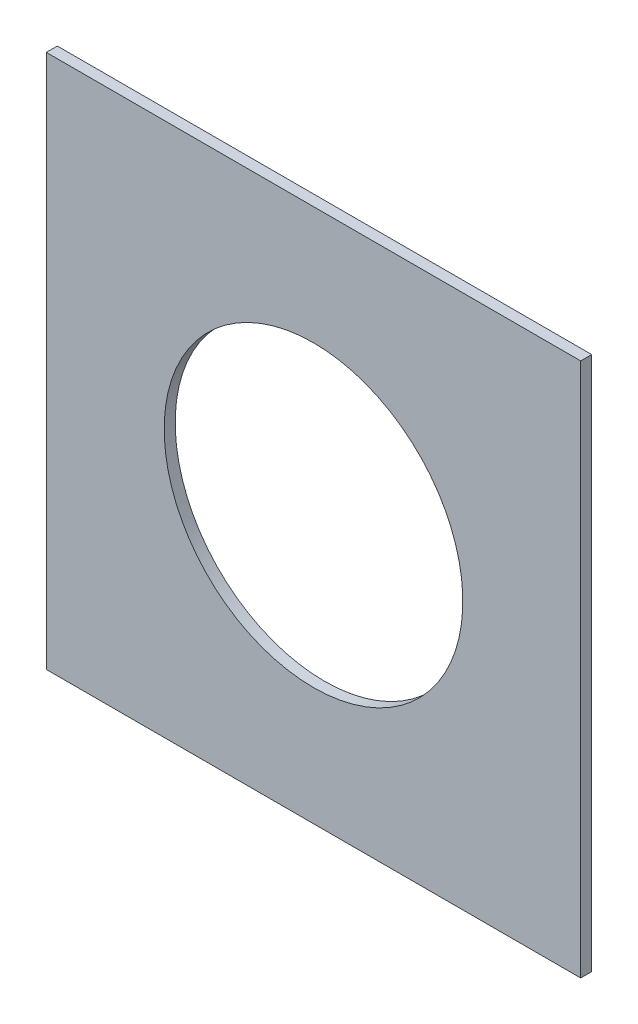
ISO-10303-21;
HEADER;
FILE_DESCRIPTION(('STEP AP214'),'2;1');
FILE_NAME('part.step','',(''),(''),'','','');
FILE_SCHEMA(('AUTOMOTIVE_DESIGN { 1 0 10303 214 1 1 1 1 }'));
ENDSEC;
DATA;
#1=APPLICATION_CONTEXT('core data for automotive mechanical design processes');
#2=APPLICATION_PROTOCOL_DEFINITION('international standard','automotive_design',2000,#1);
#3=PRODUCT_CONTEXT('',#1,'mechanical');
#4=PRODUCT('Part','Part','',(#3));
#5=PRODUCT_RELATED_PRODUCT_CATEGORY('part','',(#4));
#6=PRODUCT_DEFINITION_FORMATION('','',#4);
#7=PRODUCT_DEFINITION_CONTEXT('part definition',#1,'design');
#8=PRODUCT_DEFINITION('design','',#6,#7);
#9=PRODUCT_DEFINITION_SHAPE('','',#8);
#10=(LENGTH_UNIT() NAMED_UNIT(*) SI_UNIT(.MILLI.,.METRE.));
#11=(NAMED_UNIT(*) PLANE_ANGLE_UNIT() SI_UNIT($,.RADIAN.));
#12=(NAMED_UNIT(*) SI_UNIT($,.STERADIAN.) SOLID_ANGLE_UNIT());
#13=UNCERTAINTY_MEASURE_WITH_UNIT(LENGTH_MEASURE(1.E-05),#10,'distance_accuracy_value','');
#14=(GEOMETRIC_REPRESENTATION_CONTEXT(3) GLOBAL_UNCERTAINTY_ASSIGNED_CONTEXT((#13)) GLOBAL_UNIT_ASSIGNED_CONTEXT((#10,
#11,#12)) REPRESENTATION_CONTEXT('',''));
#15=CARTESIAN_POINT('',(0.,0.,0.));
#16=DIRECTION('',(0.,0.,1.));
#17=DIRECTION('',(1.,0.,0.));
#18=AXIS2_PLACEMENT_3D('',#15,#16,#17);
#19=CARTESIAN_POINT('',(131.31,-51.23,-0.045));
#20=DIRECTION('',(0.,0.,-1.));
#21=DIRECTION('',(0.,-1.,0.));
#22=AXIS2_PLACEMENT_3D('',#19,#20,#21);
#23=CYLINDRICAL_SURFACE('',#22,0.475);
#24=CARTESIAN_POINT('',(131.31,-51.23,1.6));
#25=DIRECTION('',(0.,0.,-1.));
#26=DIRECTION('',(0.,-1.,0.));
#27=AXIS2_PLACEMENT_3D('',#24,#25,#26);
#28=CIRCLE('',#27,0.475);
#29=CARTESIAN_POINT('',(131.31,-51.705,1.6));
#30=VERTEX_POINT('',#29);
#31=EDGE_CURVE('E71',#30,#30,#28,.T.);
#32=ORIENTED_EDGE('',*,*,#31,.T.);
#33=DIRECTION('',(0.,0.,1.));
#34=VECTOR('',#33,1.);
#35=CARTESIAN_POINT('',(131.31,-51.705,-0.045));
#36=LINE('',#35,#34);
#37=CARTESIAN_POINT('',(131.31,-51.705,1.635));
#38=VERTEX_POINT('',#37);
#39=EDGE_CURVE('E11',#30,#38,#36,.T.);
#40=ORIENTED_EDGE('',*,*,#39,.T.);
#41=CARTESIAN_POINT('',(131.31,-51.23,1.635));
#42=DIRECTION('',(0.,0.,-1.));
#43=DIRECTION('',(0.,-1.,0.));
#44=AXIS2_PLACEMENT_3D('',#41,#42,#43);
#45=CIRCLE('',#44,0.475);
#46=EDGE_CURVE('E21',#38,#38,#45,.T.);
#47=ORIENTED_EDGE('',*,*,#46,.F.);
#48=ORIENTED_EDGE('',*,*,#39,.F.);
#49=EDGE_LOOP('',(#32,#40,#47,#48));
#50=FACE_BOUND('',#49,.T.);
#51=ADVANCED_FACE('F17',(#50),#23,.F.);
#52=CARTESIAN_POINT('',(130.46,-50.38,1.6));
#53=DIRECTION('',(0.,1.,0.));
#54=DIRECTION('',(1.,0.,0.));
#55=AXIS2_PLACEMENT_3D('',#52,#53,#54);
#56=PLANE('',#55);
#57=DIRECTION('',(0.,0.,1.));
#58=VECTOR('',#57,1.);
#59=CARTESIAN_POINT('',(130.46,-50.38,1.6));
#60=LINE('',#59,#58);
#61=CARTESIAN_POINT('',(130.46,-50.38,1.6));
#62=VERTEX_POINT('',#61);
#63=CARTESIAN_POINT('',(130.46,-50.38,1.635));
#64=VERTEX_POINT('',#63);
#65=EDGE_CURVE('E63',#62,#64,#60,.T.);
#66=ORIENTED_EDGE('',*,*,#65,.T.);
#67=DIRECTION('',(1.,0.,0.));
#68=VECTOR('',#67,1.);
#69=CARTESIAN_POINT('',(130.46,-50.38,1.635));
#70=LINE('',#69,#68);
#71=CARTESIAN_POINT('',(132.16,-50.38,1.635));
#72=VERTEX_POINT('',#71);
#73=EDGE_CURVE('E98',#64,#72,#70,.T.);
#74=ORIENTED_EDGE('',*,*,#73,.T.);
#75=DIRECTION('',(0.,0.,1.));
#76=VECTOR('',#75,1.);
#77=CARTESIAN_POINT('',(132.16,-50.38,1.6));
#78=LINE('',#77,#76);
#79=CARTESIAN_POINT('',(132.16,-50.38,1.6));
#80=VERTEX_POINT('',#79);
#81=EDGE_CURVE('E66',#80,#72,#78,.T.);
#82=ORIENTED_EDGE('',*,*,#81,.F.);
#83=DIRECTION('',(1.,0.,0.));
#84=VECTOR('',#83,1.);
#85=CARTESIAN_POINT('',(130.46,-50.38,1.6));
#86=LINE('',#85,#84);
#87=EDGE_CURVE('E59',#62,#80,#86,.T.);
#88=ORIENTED_EDGE('',*,*,#87,.F.);
#89=EDGE_LOOP('',(#66,#74,#82,#88));
#90=FACE_BOUND('',#89,.T.);
#91=ADVANCED_FACE('F61',(#90),#56,.T.);
#92=CARTESIAN_POINT('',(131.31,-51.23,1.635));
#93=DIRECTION('',(0.,0.,-1.));
#94=DIRECTION('',(0.,-1.,0.));
#95=AXIS2_PLACEMENT_3D('',#92,#93,#94);
#96=PLANE('',#95);
#97=ORIENTED_EDGE('',*,*,#46,.T.);
#98=EDGE_LOOP('',(#97));
#99=FACE_BOUND('',#98,.T.);
#100=DIRECTION('',(0.,-1.,0.));
#101=VECTOR('',#100,1.);
#102=CARTESIAN_POINT('',(132.16,-50.38,1.635));
#103=LINE('',#102,#101);
#104=CARTESIAN_POINT('',(132.16,-52.08,1.635));
#105=VERTEX_POINT('',#104);
#106=EDGE_CURVE('E162',#72,#105,#103,.T.);
#107=ORIENTED_EDGE('',*,*,#106,.F.);
#108=ORIENTED_EDGE('',*,*,#73,.F.);
#109=DIRECTION('',(0.,1.,0.));
#110=VECTOR('',#109,1.);
#111=CARTESIAN_POINT('',(130.46,-52.08,1.635));
#112=LINE('',#111,#110);
#113=CARTESIAN_POINT('',(130.46,-52.08,1.635));
#114=VERTEX_POINT('',#113);
#115=EDGE_CURVE('E87',#114,#64,#112,.T.);
#116=ORIENTED_EDGE('',*,*,#115,.F.);
#117=DIRECTION('',(-1.,0.,0.));
#118=VECTOR('',#117,1.);
#119=CARTESIAN_POINT('',(132.16,-52.08,1.635));
#120=LINE('',#119,#118);
#121=EDGE_CURVE('E143',#105,#114,#120,.T.);
#122=ORIENTED_EDGE('',*,*,#121,.F.);
#123=EDGE_LOOP('',(#107,#108,#116,#122));
#124=FACE_BOUND('',#123,.T.);
#125=ADVANCED_FACE('F19',(#99,#124),#96,.F.);
#126=CARTESIAN_POINT('',(131.31,-51.23,1.6));
#127=DIRECTION('',(0.,0.,-1.));
#128=DIRECTION('',(0.,-1.,0.));
#129=AXIS2_PLACEMENT_3D('',#126,#127,#128);
#130=PLANE('',#129);
#131=ORIENTED_EDGE('',*,*,#31,.F.);
#132=EDGE_LOOP('',(#131));
#133=FACE_BOUND('',#132,.T.);
#134=DIRECTION('',(-1.,0.,0.));
#135=VECTOR('',#134,1.);
#136=CARTESIAN_POINT('',(132.16,-52.08,1.6));
#137=LINE('',#136,#135);
#138=CARTESIAN_POINT('',(132.16,-52.08,1.6));
#139=VERTEX_POINT('',#138);
#140=CARTESIAN_POINT('',(130.46,-52.08,1.6));
#141=VERTEX_POINT('',#140);
#142=EDGE_CURVE('E79',#139,#141,#137,.T.);
#143=ORIENTED_EDGE('',*,*,#142,.T.);
#144=DIRECTION('',(0.,1.,0.));
#145=VECTOR('',#144,1.);
#146=CARTESIAN_POINT('',(130.46,-52.08,1.6));
#147=LINE('',#146,#145);
#148=EDGE_CURVE('E72',#141,#62,#147,.T.);
#149=ORIENTED_EDGE('',*,*,#148,.T.);
#150=ORIENTED_EDGE('',*,*,#87,.T.);
#151=DIRECTION('',(0.,-1.,0.));
#152=VECTOR('',#151,1.);
#153=CARTESIAN_POINT('',(132.16,-50.38,1.6));
#154=LINE('',#153,#152);
#155=EDGE_CURVE('E94',#80,#139,#154,.T.);
#156=ORIENTED_EDGE('',*,*,#155,.T.);
#157=EDGE_LOOP('',(#143,#149,#150,#156));
#158=FACE_BOUND('',#157,.T.);
#159=ADVANCED_FACE('F76',(#133,#158),#130,.T.);
#160=CARTESIAN_POINT('',(130.46,-52.08,1.6));
#161=DIRECTION('',(-1.,0.,0.));
#162=DIRECTION('',(0.,0.,1.));
#163=AXIS2_PLACEMENT_3D('',#160,#161,#162);
#164=PLANE('',#163);
#165=DIRECTION('',(0.,0.,1.));
#166=VECTOR('',#165,1.);
#167=CARTESIAN_POINT('',(130.46,-52.08,1.6));
#168=LINE('',#167,#166);
#169=EDGE_CURVE('E153',#141,#114,#168,.T.);
#170=ORIENTED_EDGE('',*,*,#169,.T.);
#171=ORIENTED_EDGE('',*,*,#115,.T.);
#172=ORIENTED_EDGE('',*,*,#65,.F.);
#173=ORIENTED_EDGE('',*,*,#148,.F.);
#174=EDGE_LOOP('',(#170,#171,#172,#173));
#175=FACE_BOUND('',#174,.T.);
#176=ADVANCED_FACE('F85',(#175),#164,.T.);
#177=CARTESIAN_POINT('',(132.16,-50.38,1.6));
#178=DIRECTION('',(1.,0.,0.));
#179=DIRECTION('',(0.,1.,0.));
#180=AXIS2_PLACEMENT_3D('',#177,#178,#179);
#181=PLANE('',#180);
#182=ORIENTED_EDGE('',*,*,#81,.T.);
#183=ORIENTED_EDGE('',*,*,#106,.T.);
#184=DIRECTION('',(0.,0.,1.));
#185=VECTOR('',#184,1.);
#186=CARTESIAN_POINT('',(132.16,-52.08,1.6));
#187=LINE('',#186,#185);
#188=EDGE_CURVE('E140',#139,#105,#187,.T.);
#189=ORIENTED_EDGE('',*,*,#188,.F.);
#190=ORIENTED_EDGE('',*,*,#155,.F.);
#191=EDGE_LOOP('',(#182,#183,#189,#190));
#192=FACE_BOUND('',#191,.T.);
#193=ADVANCED_FACE('F118',(#192),#181,.T.);
#194=CARTESIAN_POINT('',(132.16,-52.08,1.6));
#195=DIRECTION('',(0.,-1.,0.));
#196=DIRECTION('',(0.,0.,-1.));
#197=AXIS2_PLACEMENT_3D('',#194,#195,#196);
#198=PLANE('',#197);
#199=ORIENTED_EDGE('',*,*,#188,.T.);
#200=ORIENTED_EDGE('',*,*,#121,.T.);
#201=ORIENTED_EDGE('',*,*,#169,.F.);
#202=ORIENTED_EDGE('',*,*,#142,.F.);
#203=EDGE_LOOP('',(#199,#200,#201,#202));
#204=FACE_BOUND('',#203,.T.);
#205=ADVANCED_FACE('F129',(#204),#198,.T.);
#206=CLOSED_SHELL('',(#51,#91,#125,#159,#176,#193,#205));
#207=MANIFOLD_SOLID_BREP('B1',#206);
#208=ADVANCED_BREP_SHAPE_REPRESENTATION('',(#18,#207),#14);
#209=SHAPE_DEFINITION_REPRESENTATION(#9,#208);
ENDSEC;
END-ISO-10303-21;
